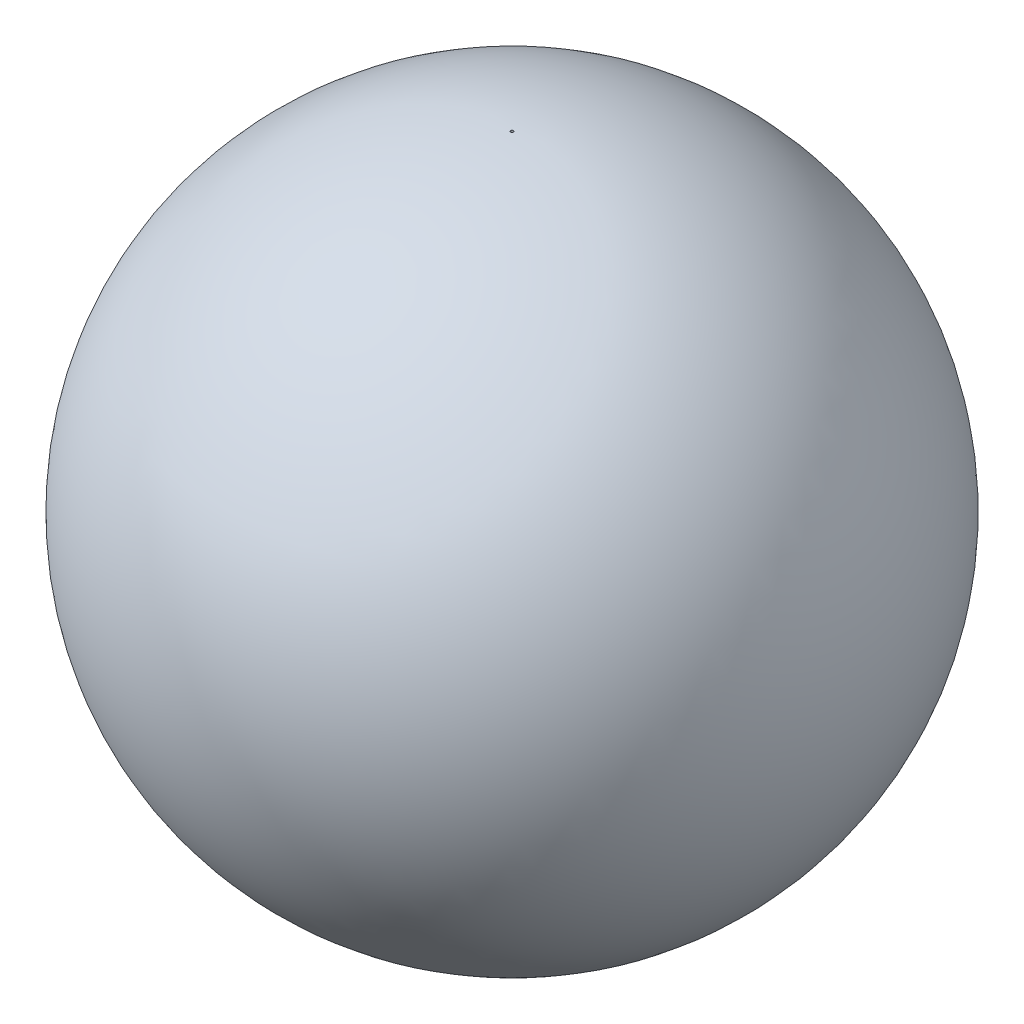
ISO-10303-21;
HEADER;
FILE_DESCRIPTION(('STEP AP214'),'2;1');
FILE_NAME('part.step','',(''),(''),'','','');
FILE_SCHEMA(('AUTOMOTIVE_DESIGN { 1 0 10303 214 1 1 1 1 }'));
ENDSEC;
DATA;
#1=APPLICATION_CONTEXT('core data for automotive mechanical design processes');
#2=APPLICATION_PROTOCOL_DEFINITION('international standard','automotive_design',2000,#1);
#3=PRODUCT_CONTEXT('',#1,'mechanical');
#4=PRODUCT('Part','Part','',(#3));
#5=PRODUCT_RELATED_PRODUCT_CATEGORY('part','',(#4));
#6=PRODUCT_DEFINITION_FORMATION('','',#4);
#7=PRODUCT_DEFINITION_CONTEXT('part definition',#1,'design');
#8=PRODUCT_DEFINITION('design','',#6,#7);
#9=PRODUCT_DEFINITION_SHAPE('','',#8);
#10=(LENGTH_UNIT() NAMED_UNIT(*) SI_UNIT(.MILLI.,.METRE.));
#11=(NAMED_UNIT(*) PLANE_ANGLE_UNIT() SI_UNIT($,.RADIAN.));
#12=(NAMED_UNIT(*) SI_UNIT($,.STERADIAN.) SOLID_ANGLE_UNIT());
#13=UNCERTAINTY_MEASURE_WITH_UNIT(LENGTH_MEASURE(1.E-05),#10,'distance_accuracy_value','');
#14=(GEOMETRIC_REPRESENTATION_CONTEXT(3) GLOBAL_UNCERTAINTY_ASSIGNED_CONTEXT((#13)) GLOBAL_UNIT_ASSIGNED_CONTEXT((#10,
#11,#12)) REPRESENTATION_CONTEXT('',''));
#15=CARTESIAN_POINT('',(0.,0.,0.));
#16=DIRECTION('',(0.,0.,1.));
#17=DIRECTION('',(1.,0.,0.));
#18=AXIS2_PLACEMENT_3D('',#15,#16,#17);
#19=CARTESIAN_POINT('',(0.,0.,0.));
#20=DIRECTION('',(0.,0.,-1.));
#21=DIRECTION('',(1.,0.,0.));
#22=AXIS2_PLACEMENT_3D('',#19,#20,#21);
#23=SPHERICAL_SURFACE('',#22,292.1);
#24=CARTESIAN_POINT('',(0.,0.,0.));
#25=DIRECTION('',(0.,-1.,0.));
#26=DIRECTION('',(0.,0.,-1.));
#27=AXIS2_PLACEMENT_3D('',#24,#25,#26);
#28=SPHERICAL_SURFACE('',#27,292.1);
#29=CARTESIAN_POINT('',(0.,292.097239117387,0.));
#30=DIRECTION('',(0.,-1.,0.));
#31=DIRECTION('',(0.,0.,-1.));
#32=AXIS2_PLACEMENT_3D('',#29,#30,#31);
#33=CIRCLE('',#32,1.27);
#34=CARTESIAN_POINT('',(0.,292.097239117387,-1.27));
#35=VERTEX_POINT('',#34);
#36=EDGE_CURVE('E45',#35,#35,#33,.T.);
#37=ORIENTED_EDGE('',*,*,#36,.F.);
#38=EDGE_LOOP('',(#37));
#39=FACE_BOUND('',#38,.T.);
#40=CARTESIAN_POINT('',(0.,-292.097239117387,0.));
#41=DIRECTION('',(0.,1.,0.));
#42=DIRECTION('',(0.,0.,1.));
#43=AXIS2_PLACEMENT_3D('',#40,#41,#42);
#44=CIRCLE('',#43,1.27);
#45=CARTESIAN_POINT('',(0.,-292.097239117387,-1.27));
#46=VERTEX_POINT('',#45);
#47=EDGE_CURVE('E35',#46,#46,#44,.T.);
#48=ORIENTED_EDGE('',*,*,#47,.F.);
#49=EDGE_LOOP('',(#48));
#50=FACE_BOUND('',#49,.T.);
#51=ADVANCED_FACE('F32',(#39,#50),#28,.F.);
#52=CARTESIAN_POINT('',(0.,381.508,0.));
#53=DIRECTION('',(0.,-1.,0.));
#54=DIRECTION('',(0.,0.,-1.));
#55=AXIS2_PLACEMENT_3D('',#52,#53,#54);
#56=CYLINDRICAL_SURFACE('',#55,1.27);
#57=CARTESIAN_POINT('',(0.,298.447297860108,0.));
#58=DIRECTION('',(0.,-1.,0.));
#59=DIRECTION('',(0.,0.,-1.));
#60=AXIS2_PLACEMENT_3D('',#57,#58,#59);
#61=CIRCLE('',#60,1.27);
#62=CARTESIAN_POINT('',(0.,298.447297860108,-1.27));
#63=VERTEX_POINT('',#62);
#64=EDGE_CURVE('E39',#63,#63,#61,.T.);
#65=CARTESIAN_POINT('',(0.,298.447297860108,-1.27));
#66=CARTESIAN_POINT('',(0.,298.381151414871,-1.27));
#67=CARTESIAN_POINT('',(0.,298.315004969635,-1.27));
#68=CARTESIAN_POINT('',(0.,298.182712079161,-1.27));
#69=CARTESIAN_POINT('',(0.,298.116565633925,-1.27));
#70=CARTESIAN_POINT('',(0.,297.984272743451,-1.27));
#71=CARTESIAN_POINT('',(0.,297.918126298215,-1.27));
#72=CARTESIAN_POINT('',(0.,297.785833407741,-1.27));
#73=CARTESIAN_POINT('',(0.,297.719686962505,-1.27));
#74=CARTESIAN_POINT('',(0.,297.587394072031,-1.27));
#75=CARTESIAN_POINT('',(0.,297.521247626795,-1.27));
#76=CARTESIAN_POINT('',(0.,297.388954736321,-1.27));
#77=CARTESIAN_POINT('',(0.,297.322808291084,-1.27));
#78=CARTESIAN_POINT('',(0.,297.190515400611,-1.27));
#79=CARTESIAN_POINT('',(0.,297.124368955374,-1.27));
#80=CARTESIAN_POINT('',(0.,296.992076064901,-1.27));
#81=CARTESIAN_POINT('',(0.,296.925929619664,-1.27));
#82=CARTESIAN_POINT('',(0.,296.793636729191,-1.27));
#83=CARTESIAN_POINT('',(0.,296.727490283954,-1.27));
#84=CARTESIAN_POINT('',(0.,296.595197393481,-1.27));
#85=CARTESIAN_POINT('',(0.,296.529050948244,-1.27));
#86=CARTESIAN_POINT('',(0.,296.396758057771,-1.27));
#87=CARTESIAN_POINT('',(0.,296.330611612534,-1.27));
#88=CARTESIAN_POINT('',(0.,296.198318722061,-1.27));
#89=CARTESIAN_POINT('',(0.,296.132172276824,-1.27));
#90=CARTESIAN_POINT('',(0.,295.999879386351,-1.27));
#91=CARTESIAN_POINT('',(0.,295.933732941114,-1.27));
#92=CARTESIAN_POINT('',(0.,295.801440050641,-1.27));
#93=CARTESIAN_POINT('',(0.,295.735293605404,-1.27));
#94=CARTESIAN_POINT('',(0.,295.603000714931,-1.27));
#95=CARTESIAN_POINT('',(0.,295.536854269694,-1.27));
#96=CARTESIAN_POINT('',(0.,295.404561379221,-1.27));
#97=CARTESIAN_POINT('',(0.,295.338414933984,-1.27));
#98=CARTESIAN_POINT('',(0.,295.206122043511,-1.27));
#99=CARTESIAN_POINT('',(0.,295.139975598274,-1.27));
#100=CARTESIAN_POINT('',(0.,295.007682707801,-1.27));
#101=CARTESIAN_POINT('',(0.,294.941536262564,-1.27));
#102=CARTESIAN_POINT('',(0.,294.809243372091,-1.27));
#103=CARTESIAN_POINT('',(0.,294.743096926854,-1.27));
#104=CARTESIAN_POINT('',(0.,294.610804036381,-1.27));
#105=CARTESIAN_POINT('',(0.,294.544657591144,-1.27));
#106=CARTESIAN_POINT('',(0.,294.412364700671,-1.27));
#107=CARTESIAN_POINT('',(0.,294.346218255434,-1.27));
#108=CARTESIAN_POINT('',(0.,294.213925364961,-1.27));
#109=CARTESIAN_POINT('',(0.,294.147778919724,-1.27));
#110=CARTESIAN_POINT('',(0.,294.015486029251,-1.27));
#111=CARTESIAN_POINT('',(0.,293.949339584014,-1.27));
#112=CARTESIAN_POINT('',(0.,293.817046693541,-1.27));
#113=CARTESIAN_POINT('',(0.,293.750900248304,-1.27));
#114=CARTESIAN_POINT('',(0.,293.618607357831,-1.27));
#115=CARTESIAN_POINT('',(0.,293.552460912594,-1.27));
#116=CARTESIAN_POINT('',(0.,293.420168022121,-1.27));
#117=CARTESIAN_POINT('',(0.,293.354021576884,-1.27));
#118=CARTESIAN_POINT('',(0.,293.221728686411,-1.27));
#119=CARTESIAN_POINT('',(0.,293.155582241174,-1.27));
#120=CARTESIAN_POINT('',(0.,293.023289350701,-1.27));
#121=CARTESIAN_POINT('',(0.,292.957142905464,-1.27));
#122=CARTESIAN_POINT('',(0.,292.824850014991,-1.27));
#123=CARTESIAN_POINT('',(0.,292.758703569754,-1.27));
#124=CARTESIAN_POINT('',(0.,292.626410679281,-1.27));
#125=CARTESIAN_POINT('',(0.,292.560264234044,-1.27));
#126=CARTESIAN_POINT('',(0.,292.427971343571,-1.27));
#127=CARTESIAN_POINT('',(0.,292.361824898334,-1.27));
#128=CARTESIAN_POINT('',(0.,292.22953200786,-1.27));
#129=CARTESIAN_POINT('',(0.,292.163385562624,-1.27));
#130=CARTESIAN_POINT('',(0.,292.097239117387,-1.27));
#131=B_SPLINE_CURVE_WITH_KNOTS('',3,(#65,#66,#67,#68,#69,#70,#71,#72,#73,#74,#75,#76,#77,#78,
#79,#80,#81,#82,#83,#84,#85,#86,#87,#88,#89,#90,#91,#92,#93,#94,#95,#96,#97,#98,#99,#100,#101,
#102,#103,#104,#105,#106,#107,#108,#109,#110,#111,#112,#113,#114,#115,#116,#117,#118,#119,#120,
#121,#122,#123,#124,#125,#126,#127,#128,#129,#130),.UNSPECIFIED.,.F.,.F.,(4,2,2,2,2,2,2,2,2,2,2,
2,2,2,2,2,2,2,2,2,2,2,2,2,2,2,2,2,2,2,2,2,4),(0.,0.19843933571001,0.39687867142002,
0.595318007130086,0.793757342840096,0.992196678550106,1.19063601426017,1.38907534997018,
1.58751468568019,1.7859540213902,1.98439335710027,2.18283269281028,2.38127202852029,
2.57971136423035,2.77815069994036,2.97659003565037,3.17502937136044,3.37346870707045,
3.57190804278046,3.77034737849052,3.96878671420053,4.16722604991054,4.36566538562061,
4.56410472133062,4.76254405704063,4.96098339275069,5.15942272846071,5.35786206417072,
5.55630139988078,5.75474073559079,5.9531800713008,6.15161940701087,6.35005874272088),.UNSPECIFIED.);
#132=EDGE_CURVE('BSEAM55',#63,#35,#131,.T.);
#133=ORIENTED_EDGE('',*,*,#64,.F.);
#134=ORIENTED_EDGE('',*,*,#36,.T.);
#135=ORIENTED_EDGE('',*,*,#132,.T.);
#136=ORIENTED_EDGE('',*,*,#132,.F.);
#137=EDGE_LOOP('',(#133,#135,#134,#136));
#138=FACE_BOUND('',#137,.T.);
#139=ADVANCED_FACE('F55',(#138),#56,.F.);
#140=CARTESIAN_POINT('',(0.,-298.447297860108,0.));
#141=DIRECTION('',(0.,1.,0.));
#142=DIRECTION('',(0.,0.,1.));
#143=AXIS2_PLACEMENT_3D('',#140,#141,#142);
#144=CIRCLE('',#143,1.27);
#145=CARTESIAN_POINT('',(0.,-298.447297860108,-1.27));
#146=VERTEX_POINT('',#145);
#147=EDGE_CURVE('E10',#146,#146,#144,.T.);
#148=CARTESIAN_POINT('',(0.,-298.447297860108,-1.27));
#149=CARTESIAN_POINT('',(0.,-298.381151414871,-1.27));
#150=CARTESIAN_POINT('',(0.,-298.315004969634,-1.27));
#151=CARTESIAN_POINT('',(0.,-298.182712079161,-1.27));
#152=CARTESIAN_POINT('',(0.,-298.116565633925,-1.27));
#153=CARTESIAN_POINT('',(0.,-297.984272743451,-1.27));
#154=CARTESIAN_POINT('',(0.,-297.918126298214,-1.27));
#155=CARTESIAN_POINT('',(0.,-297.785833407741,-1.27));
#156=CARTESIAN_POINT('',(0.,-297.719686962504,-1.27));
#157=CARTESIAN_POINT('',(0.,-297.587394072031,-1.27));
#158=CARTESIAN_POINT('',(0.,-297.521247626794,-1.27));
#159=CARTESIAN_POINT('',(0.,-297.388954736321,-1.27));
#160=CARTESIAN_POINT('',(0.,-297.322808291084,-1.27));
#161=CARTESIAN_POINT('',(0.,-297.190515400611,-1.27));
#162=CARTESIAN_POINT('',(0.,-297.124368955374,-1.27));
#163=CARTESIAN_POINT('',(0.,-296.992076064901,-1.27));
#164=CARTESIAN_POINT('',(0.,-296.925929619664,-1.27));
#165=CARTESIAN_POINT('',(0.,-296.793636729191,-1.27));
#166=CARTESIAN_POINT('',(0.,-296.727490283954,-1.27));
#167=CARTESIAN_POINT('',(0.,-296.595197393481,-1.27));
#168=CARTESIAN_POINT('',(0.,-296.529050948244,-1.27));
#169=CARTESIAN_POINT('',(0.,-296.396758057771,-1.27));
#170=CARTESIAN_POINT('',(0.,-296.330611612534,-1.27));
#171=CARTESIAN_POINT('',(0.,-296.198318722061,-1.27));
#172=CARTESIAN_POINT('',(0.,-296.132172276824,-1.27));
#173=CARTESIAN_POINT('',(0.,-295.999879386351,-1.27));
#174=CARTESIAN_POINT('',(0.,-295.933732941114,-1.27));
#175=CARTESIAN_POINT('',(0.,-295.801440050641,-1.27));
#176=CARTESIAN_POINT('',(0.,-295.735293605404,-1.27));
#177=CARTESIAN_POINT('',(0.,-295.603000714931,-1.27));
#178=CARTESIAN_POINT('',(0.,-295.536854269694,-1.27));
#179=CARTESIAN_POINT('',(0.,-295.404561379221,-1.27));
#180=CARTESIAN_POINT('',(0.,-295.338414933984,-1.27));
#181=CARTESIAN_POINT('',(0.,-295.206122043511,-1.27));
#182=CARTESIAN_POINT('',(0.,-295.139975598274,-1.27));
#183=CARTESIAN_POINT('',(0.,-295.007682707801,-1.27));
#184=CARTESIAN_POINT('',(0.,-294.941536262564,-1.27));
#185=CARTESIAN_POINT('',(0.,-294.809243372091,-1.27));
#186=CARTESIAN_POINT('',(0.,-294.743096926854,-1.27));
#187=CARTESIAN_POINT('',(0.,-294.610804036381,-1.27));
#188=CARTESIAN_POINT('',(0.,-294.544657591144,-1.27));
#189=CARTESIAN_POINT('',(0.,-294.412364700671,-1.27));
#190=CARTESIAN_POINT('',(0.,-294.346218255434,-1.27));
#191=CARTESIAN_POINT('',(0.,-294.213925364961,-1.27));
#192=CARTESIAN_POINT('',(0.,-294.147778919724,-1.27));
#193=CARTESIAN_POINT('',(0.,-294.015486029251,-1.27));
#194=CARTESIAN_POINT('',(0.,-293.949339584014,-1.27));
#195=CARTESIAN_POINT('',(0.,-293.81704669354,-1.27));
#196=CARTESIAN_POINT('',(0.,-293.750900248304,-1.27));
#197=CARTESIAN_POINT('',(0.,-293.618607357831,-1.27));
#198=CARTESIAN_POINT('',(0.,-293.552460912594,-1.27));
#199=CARTESIAN_POINT('',(0.,-293.42016802212,-1.27));
#200=CARTESIAN_POINT('',(0.,-293.354021576884,-1.27));
#201=CARTESIAN_POINT('',(0.,-293.22172868641,-1.27));
#202=CARTESIAN_POINT('',(0.,-293.155582241174,-1.27));
#203=CARTESIAN_POINT('',(0.,-293.0232893507,-1.27));
#204=CARTESIAN_POINT('',(0.,-292.957142905464,-1.27));
#205=CARTESIAN_POINT('',(0.,-292.82485001499,-1.27));
#206=CARTESIAN_POINT('',(0.,-292.758703569754,-1.27));
#207=CARTESIAN_POINT('',(0.,-292.62641067928,-1.27));
#208=CARTESIAN_POINT('',(0.,-292.560264234044,-1.27));
#209=CARTESIAN_POINT('',(0.,-292.42797134357,-1.27));
#210=CARTESIAN_POINT('',(0.,-292.361824898334,-1.27));
#211=CARTESIAN_POINT('',(0.,-292.22953200786,-1.27));
#212=CARTESIAN_POINT('',(0.,-292.163385562624,-1.27));
#213=CARTESIAN_POINT('',(0.,-292.097239117387,-1.27));
#214=B_SPLINE_CURVE_WITH_KNOTS('',3,(#148,#149,#150,#151,#152,#153,#154,#155,#156,#157,#158,
#159,#160,#161,#162,#163,#164,#165,#166,#167,#168,#169,#170,#171,#172,#173,#174,#175,#176,#177,
#178,#179,#180,#181,#182,#183,#184,#185,#186,#187,#188,#189,#190,#191,#192,#193,#194,#195,#196,
#197,#198,#199,#200,#201,#202,#203,#204,#205,#206,#207,#208,#209,#210,#211,#212,#213),
.UNSPECIFIED.,.F.,.F.,(4,2,2,2,2,2,2,2,2,2,2,2,2,2,2,2,2,2,2,2,2,2,2,2,2,2,2,2,2,2,2,2,4),(0.,
0.198439335710066,0.39687867142002,0.595318007130086,0.793757342840151,0.992196678550106,
1.19063601426017,1.38907534997024,1.5875146856803,1.78595402139026,1.98439335710032,
2.18283269281039,2.38127202852034,2.57971136423041,2.77815069994047,2.97659003565043,
3.17502937136049,3.37346870707056,3.57190804278051,3.77034737849058,3.96878671420064,
4.1672260499106,4.36566538562067,4.56410472133073,4.76254405704069,4.96098339275075,
5.15942272846082,5.35786206417088,5.55630139988084,5.7547407355909,5.95318007130097,
6.15161940701092,6.35005874272099),.UNSPECIFIED.);
#215=EDGE_CURVE('BSEAM52',#146,#46,#214,.T.);
#216=ORIENTED_EDGE('',*,*,#147,.F.);
#217=ORIENTED_EDGE('',*,*,#47,.T.);
#218=ORIENTED_EDGE('',*,*,#215,.T.);
#219=ORIENTED_EDGE('',*,*,#215,.F.);
#220=EDGE_LOOP('',(#216,#218,#217,#219));
#221=FACE_BOUND('',#220,.T.);
#222=ADVANCED_FACE('F52',(#221),#56,.F.);
#223=CARTESIAN_POINT('',(0.,0.,0.));
#224=DIRECTION('',(0.,0.,-1.));
#225=DIRECTION('',(1.,0.,0.));
#226=AXIS2_PLACEMENT_3D('',#223,#224,#225);
#227=SPHERICAL_SURFACE('',#226,298.45);
#228=CARTESIAN_POINT('',(0.,0.,0.));
#229=DIRECTION('',(0.,-1.,0.));
#230=DIRECTION('',(0.,0.,-1.));
#231=AXIS2_PLACEMENT_3D('',#228,#229,#230);
#232=SPHERICAL_SURFACE('',#231,298.45);
#233=ORIENTED_EDGE('',*,*,#64,.T.);
#234=EDGE_LOOP('',(#233));
#235=FACE_BOUND('',#234,.T.);
#236=ORIENTED_EDGE('',*,*,#147,.T.);
#237=EDGE_LOOP('',(#236));
#238=FACE_BOUND('',#237,.T.);
#239=ADVANCED_FACE('F65',(#235,#238),#232,.T.);
#240=CLOSED_SHELL('',(#51,#139,#222,#239));
#241=MANIFOLD_SOLID_BREP('B2',#240);
#242=ADVANCED_BREP_SHAPE_REPRESENTATION('',(#18,#241),#14);
#243=SHAPE_DEFINITION_REPRESENTATION(#9,#242);
ENDSEC;
END-ISO-10303-21;
